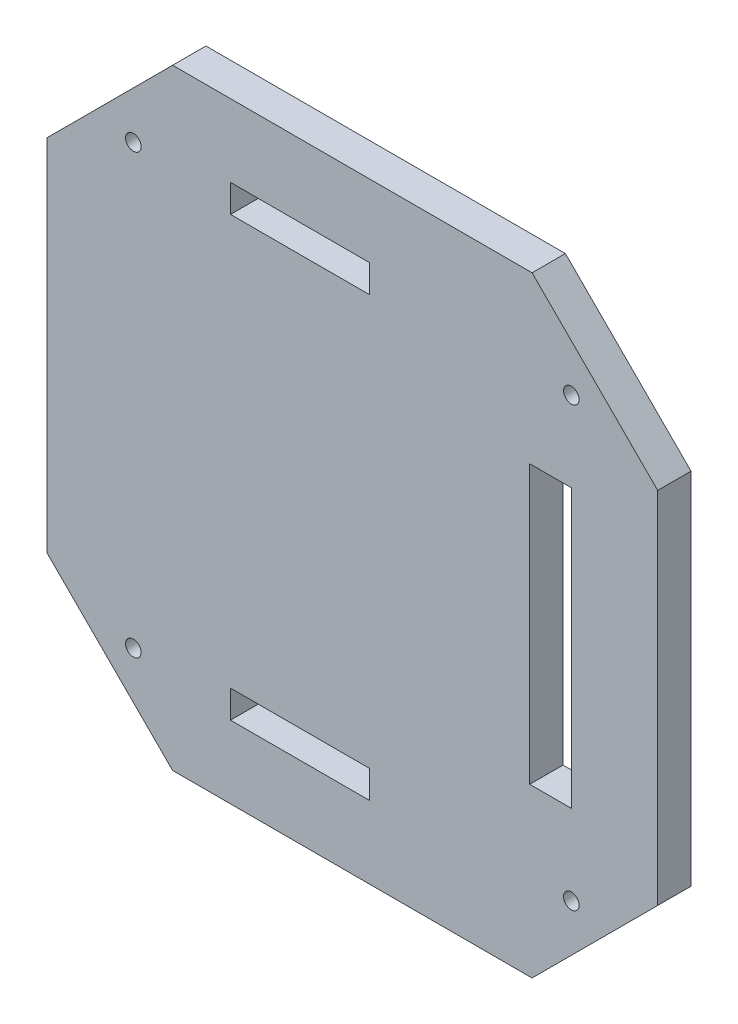
ISO-10303-21;
HEADER;
FILE_DESCRIPTION(('STEP AP214'),'2;1');
FILE_NAME('part.step','',(''),(''),'','','');
FILE_SCHEMA(('AUTOMOTIVE_DESIGN { 1 0 10303 214 1 1 1 1 }'));
ENDSEC;
DATA;
#1=APPLICATION_CONTEXT('core data for automotive mechanical design processes');
#2=APPLICATION_PROTOCOL_DEFINITION('international standard','automotive_design',2000,#1);
#3=PRODUCT_CONTEXT('',#1,'mechanical');
#4=PRODUCT('Part','Part','',(#3));
#5=PRODUCT_RELATED_PRODUCT_CATEGORY('part','',(#4));
#6=PRODUCT_DEFINITION_FORMATION('','',#4);
#7=PRODUCT_DEFINITION_CONTEXT('part definition',#1,'design');
#8=PRODUCT_DEFINITION('design','',#6,#7);
#9=PRODUCT_DEFINITION_SHAPE('','',#8);
#10=(LENGTH_UNIT() NAMED_UNIT(*) SI_UNIT(.MILLI.,.METRE.));
#11=(NAMED_UNIT(*) PLANE_ANGLE_UNIT() SI_UNIT($,.RADIAN.));
#12=(NAMED_UNIT(*) SI_UNIT($,.STERADIAN.) SOLID_ANGLE_UNIT());
#13=UNCERTAINTY_MEASURE_WITH_UNIT(LENGTH_MEASURE(1.E-05),#10,'distance_accuracy_value','');
#14=(GEOMETRIC_REPRESENTATION_CONTEXT(3) GLOBAL_UNCERTAINTY_ASSIGNED_CONTEXT((#13)) GLOBAL_UNIT_ASSIGNED_CONTEXT((#10,
#11,#12)) REPRESENTATION_CONTEXT('',''));
#15=CARTESIAN_POINT('',(0.,0.,0.));
#16=DIRECTION('',(0.,0.,1.));
#17=DIRECTION('',(1.,0.,0.));
#18=AXIS2_PLACEMENT_3D('',#15,#16,#17);
#19=CARTESIAN_POINT('',(9.63663148999142,-40.1714036228837,-33.5));
#20=DIRECTION('',(0.,0.,1.));
#21=DIRECTION('',(1.,0.,0.));
#22=AXIS2_PLACEMENT_3D('',#19,#20,#21);
#23=CYLINDRICAL_SURFACE('',#22,1.4);
#24=CARTESIAN_POINT('',(9.63663148999142,-40.1714036228837,-27.5));
#25=DIRECTION('',(0.,0.,-1.));
#26=DIRECTION('',(-1.,0.,0.));
#27=AXIS2_PLACEMENT_3D('',#24,#25,#26);
#28=CIRCLE('',#27,1.4);
#29=CARTESIAN_POINT('',(8.23663148999142,-40.1714036228837,-27.5));
#30=VERTEX_POINT('',#29);
#31=EDGE_CURVE('E299',#30,#30,#28,.T.);
#32=ORIENTED_EDGE('',*,*,#31,.F.);
#33=EDGE_LOOP('',(#32));
#34=FACE_BOUND('',#33,.T.);
#35=CARTESIAN_POINT('',(9.63663148999142,-40.1714036228837,-30.5));
#36=DIRECTION('',(0.,0.,-1.));
#37=DIRECTION('',(-1.,0.,0.));
#38=AXIS2_PLACEMENT_3D('',#35,#36,#37);
#39=CIRCLE('',#38,1.4);
#40=CARTESIAN_POINT('',(8.23663148999142,-40.1714036228837,-30.5));
#41=VERTEX_POINT('',#40);
#42=EDGE_CURVE('E36',#41,#41,#39,.T.);
#43=ORIENTED_EDGE('',*,*,#42,.T.);
#44=EDGE_LOOP('',(#43));
#45=FACE_BOUND('',#44,.T.);
#46=ADVANCED_FACE('F32',(#34,#45),#23,.F.);
#47=CARTESIAN_POINT('',(9.63663148999096,38.7158980049077,-33.5));
#48=DIRECTION('',(0.,0.,1.));
#49=DIRECTION('',(1.,0.,0.));
#50=AXIS2_PLACEMENT_3D('',#47,#48,#49);
#51=CYLINDRICAL_SURFACE('',#50,1.4);
#52=CARTESIAN_POINT('',(9.63663148999096,38.7158980049077,-27.5));
#53=DIRECTION('',(0.,0.,-1.));
#54=DIRECTION('',(-1.,0.,0.));
#55=AXIS2_PLACEMENT_3D('',#52,#53,#54);
#56=CIRCLE('',#55,1.4);
#57=CARTESIAN_POINT('',(8.23663148999096,38.7158980049077,-27.5));
#58=VERTEX_POINT('',#57);
#59=EDGE_CURVE('E308',#58,#58,#56,.T.);
#60=ORIENTED_EDGE('',*,*,#59,.F.);
#61=EDGE_LOOP('',(#60));
#62=FACE_BOUND('',#61,.T.);
#63=CARTESIAN_POINT('',(9.63663148999096,38.7158980049077,-30.5));
#64=DIRECTION('',(0.,0.,-1.));
#65=DIRECTION('',(-1.,0.,0.));
#66=AXIS2_PLACEMENT_3D('',#63,#64,#65);
#67=CIRCLE('',#66,1.4);
#68=CARTESIAN_POINT('',(8.23663148999096,38.7158980049077,-30.5));
#69=VERTEX_POINT('',#68);
#70=EDGE_CURVE('E281',#69,#69,#67,.T.);
#71=ORIENTED_EDGE('',*,*,#70,.T.);
#72=EDGE_LOOP('',(#71));
#73=FACE_BOUND('',#72,.T.);
#74=ADVANCED_FACE('F371',(#62,#73),#51,.F.);
#75=CARTESIAN_POINT('',(-69.2506701378009,-40.1714036228842,-33.5));
#76=DIRECTION('',(0.,0.,1.));
#77=DIRECTION('',(1.,0.,0.));
#78=AXIS2_PLACEMENT_3D('',#75,#76,#77);
#79=CYLINDRICAL_SURFACE('',#78,1.4);
#80=CARTESIAN_POINT('',(-69.2506701378009,-40.1714036228842,-27.5));
#81=DIRECTION('',(0.,0.,-1.));
#82=DIRECTION('',(-1.,0.,0.));
#83=AXIS2_PLACEMENT_3D('',#80,#81,#82);
#84=CIRCLE('',#83,1.4);
#85=CARTESIAN_POINT('',(-70.6506701378009,-40.1714036228842,-27.5));
#86=VERTEX_POINT('',#85);
#87=EDGE_CURVE('E302',#86,#86,#84,.T.);
#88=ORIENTED_EDGE('',*,*,#87,.F.);
#89=EDGE_LOOP('',(#88));
#90=FACE_BOUND('',#89,.T.);
#91=CARTESIAN_POINT('',(-69.2506701378009,-40.1714036228842,-30.5));
#92=DIRECTION('',(0.,0.,-1.));
#93=DIRECTION('',(-1.,0.,0.));
#94=AXIS2_PLACEMENT_3D('',#91,#92,#93);
#95=CIRCLE('',#94,1.4);
#96=CARTESIAN_POINT('',(-70.6506701378009,-40.1714036228842,-30.5));
#97=VERTEX_POINT('',#96);
#98=EDGE_CURVE('E288',#97,#97,#95,.T.);
#99=ORIENTED_EDGE('',*,*,#98,.T.);
#100=EDGE_LOOP('',(#99));
#101=FACE_BOUND('',#100,.T.);
#102=ADVANCED_FACE('F479',(#90,#101),#79,.F.);
#103=CARTESIAN_POINT('',(-69.2506701378011,38.7158980049076,-33.5));
#104=DIRECTION('',(0.,0.,1.));
#105=DIRECTION('',(1.,0.,0.));
#106=AXIS2_PLACEMENT_3D('',#103,#104,#105);
#107=CYLINDRICAL_SURFACE('',#106,1.4);
#108=CARTESIAN_POINT('',(-69.2506701378011,38.7158980049076,-27.5));
#109=DIRECTION('',(0.,0.,-1.));
#110=DIRECTION('',(-1.,0.,0.));
#111=AXIS2_PLACEMENT_3D('',#108,#109,#110);
#112=CIRCLE('',#111,1.4);
#113=CARTESIAN_POINT('',(-70.6506701378011,38.7158980049076,-27.5));
#114=VERTEX_POINT('',#113);
#115=EDGE_CURVE('E305',#114,#114,#112,.T.);
#116=ORIENTED_EDGE('',*,*,#115,.F.);
#117=EDGE_LOOP('',(#116));
#118=FACE_BOUND('',#117,.T.);
#119=CARTESIAN_POINT('',(-69.2506701378011,38.7158980049076,-30.5));
#120=DIRECTION('',(0.,0.,-1.));
#121=DIRECTION('',(-1.,0.,0.));
#122=AXIS2_PLACEMENT_3D('',#119,#120,#121);
#123=CIRCLE('',#122,1.4);
#124=CARTESIAN_POINT('',(-70.6506701378011,38.7158980049076,-30.5));
#125=VERTEX_POINT('',#124);
#126=EDGE_CURVE('E295',#125,#125,#123,.T.);
#127=ORIENTED_EDGE('',*,*,#126,.T.);
#128=EDGE_LOOP('',(#127));
#129=FACE_BOUND('',#128,.T.);
#130=ADVANCED_FACE('F390',(#118,#129),#107,.F.);
#131=CARTESIAN_POINT('',(0.,0.,-33.5));
#132=DIRECTION('',(0.,0.,1.));
#133=DIRECTION('',(1.,0.,0.));
#134=AXIS2_PLACEMENT_3D('',#131,#132,#133);
#135=PLANE('',#134);
#136=DIRECTION('',(-1.,0.,0.));
#137=VECTOR('',#136,1.);
#138=CARTESIAN_POINT('',(-51.7506701378009,-42.6714036228842,-33.5));
#139=LINE('',#138,#137);
#140=CARTESIAN_POINT('',(-26.7506701378009,-42.6714036228842,-33.5));
#141=VERTEX_POINT('',#140);
#142=CARTESIAN_POINT('',(-51.7506701378009,-42.6714036228842,-33.5));
#143=VERTEX_POINT('',#142);
#144=EDGE_CURVE('E201',#141,#143,#139,.T.);
#145=ORIENTED_EDGE('',*,*,#144,.F.);
#146=DIRECTION('',(0.,-1.,0.));
#147=VECTOR('',#146,1.);
#148=CARTESIAN_POINT('',(-26.7506701378009,-42.6714036228842,-33.5));
#149=LINE('',#148,#147);
#150=CARTESIAN_POINT('',(-26.7506701378009,-37.6714036228842,-33.5));
#151=VERTEX_POINT('',#150);
#152=EDGE_CURVE('E49',#151,#141,#149,.T.);
#153=ORIENTED_EDGE('',*,*,#152,.F.);
#154=DIRECTION('',(1.,0.,0.));
#155=VECTOR('',#154,1.);
#156=CARTESIAN_POINT('',(-51.7506701378009,-37.6714036228842,-33.5));
#157=LINE('',#156,#155);
#158=CARTESIAN_POINT('',(-51.7506701378009,-37.6714036228842,-33.5));
#159=VERTEX_POINT('',#158);
#160=EDGE_CURVE('E192',#159,#151,#157,.T.);
#161=ORIENTED_EDGE('',*,*,#160,.F.);
#162=DIRECTION('',(0.,1.,0.));
#163=VECTOR('',#162,1.);
#164=CARTESIAN_POINT('',(-51.7506701378009,-42.6714036228842,-33.5));
#165=LINE('',#164,#163);
#166=EDGE_CURVE('E195',#143,#159,#165,.T.);
#167=ORIENTED_EDGE('',*,*,#166,.F.);
#168=EDGE_LOOP('',(#145,#153,#161,#167));
#169=FACE_BOUND('',#168,.T.);
#170=DIRECTION('',(0.,-1.,0.));
#171=VECTOR('',#170,1.);
#172=CARTESIAN_POINT('',(-26.7506701378009,41.2158980049077,-33.5));
#173=LINE('',#172,#171);
#174=CARTESIAN_POINT('',(-26.7506701378009,41.2158980049077,-33.5));
#175=VERTEX_POINT('',#174);
#176=CARTESIAN_POINT('',(-26.7506701378009,36.2158980049077,-33.5));
#177=VERTEX_POINT('',#176);
#178=EDGE_CURVE('E227',#175,#177,#173,.T.);
#179=ORIENTED_EDGE('',*,*,#178,.F.);
#180=DIRECTION('',(1.,0.,0.));
#181=VECTOR('',#180,1.);
#182=CARTESIAN_POINT('',(-51.7506701378009,41.2158980049077,-33.5));
#183=LINE('',#182,#181);
#184=CARTESIAN_POINT('',(-51.7506701378009,41.2158980049077,-33.5));
#185=VERTEX_POINT('',#184);
#186=EDGE_CURVE('E57',#185,#175,#183,.T.);
#187=ORIENTED_EDGE('',*,*,#186,.F.);
#188=DIRECTION('',(0.,1.,0.));
#189=VECTOR('',#188,1.);
#190=CARTESIAN_POINT('',(-51.7506701378009,41.2158980049077,-33.5));
#191=LINE('',#190,#189);
#192=CARTESIAN_POINT('',(-51.7506701378009,36.2158980049077,-33.5));
#193=VERTEX_POINT('',#192);
#194=EDGE_CURVE('E216',#193,#185,#191,.T.);
#195=ORIENTED_EDGE('',*,*,#194,.F.);
#196=DIRECTION('',(-1.,0.,0.));
#197=VECTOR('',#196,1.);
#198=CARTESIAN_POINT('',(-51.7506701378009,36.2158980049077,-33.5));
#199=LINE('',#198,#197);
#200=EDGE_CURVE('E231',#177,#193,#199,.T.);
#201=ORIENTED_EDGE('',*,*,#200,.F.);
#202=EDGE_LOOP('',(#179,#187,#195,#201));
#203=FACE_BOUND('',#202,.T.);
#204=DIRECTION('',(-1.,0.,0.));
#205=VECTOR('',#204,1.);
#206=CARTESIAN_POINT('',(9.6366314899914,-25.727752808988,-33.5));
#207=LINE('',#206,#205);
#208=CARTESIAN_POINT('',(9.6366314899914,-25.727752808988,-33.5));
#209=VERTEX_POINT('',#208);
#210=CARTESIAN_POINT('',(2.1366314899914,-25.727752808988,-33.5));
#211=VERTEX_POINT('',#210);
#212=EDGE_CURVE('E258',#209,#211,#207,.T.);
#213=ORIENTED_EDGE('',*,*,#212,.F.);
#214=DIRECTION('',(0.,-1.,0.));
#215=VECTOR('',#214,1.);
#216=CARTESIAN_POINT('',(9.63663148999141,24.272247191012,-33.5));
#217=LINE('',#216,#215);
#218=CARTESIAN_POINT('',(9.63663148999141,24.272247191012,-33.5));
#219=VERTEX_POINT('',#218);
#220=EDGE_CURVE('E256',#219,#209,#217,.T.);
#221=ORIENTED_EDGE('',*,*,#220,.F.);
#222=DIRECTION('',(1.,0.,0.));
#223=VECTOR('',#222,1.);
#224=CARTESIAN_POINT('',(9.63663148999141,24.272247191012,-33.5));
#225=LINE('',#224,#223);
#226=CARTESIAN_POINT('',(2.13663148999141,24.272247191012,-33.5));
#227=VERTEX_POINT('',#226);
#228=EDGE_CURVE('E246',#227,#219,#225,.T.);
#229=ORIENTED_EDGE('',*,*,#228,.F.);
#230=DIRECTION('',(0.,1.,0.));
#231=VECTOR('',#230,1.);
#232=CARTESIAN_POINT('',(2.13663148999141,24.272247191012,-33.5));
#233=LINE('',#232,#231);
#234=EDGE_CURVE('E261',#211,#227,#233,.T.);
#235=ORIENTED_EDGE('',*,*,#234,.F.);
#236=EDGE_LOOP('',(#213,#221,#229,#235));
#237=FACE_BOUND('',#236,.T.);
#238=CARTESIAN_POINT('',(9.63663148999114,-40.171403622884,-33.5));
#239=DIRECTION('',(0.,0.,-1.));
#240=DIRECTION('',(1.,0.,0.));
#241=AXIS2_PLACEMENT_3D('',#238,#239,#240);
#242=CIRCLE('',#241,3.25000000000001);
#243=CARTESIAN_POINT('',(12.8866314899912,-40.171403622884,-33.5));
#244=VERTEX_POINT('',#243);
#245=EDGE_CURVE('E208',#244,#244,#242,.T.);
#246=ORIENTED_EDGE('',*,*,#245,.F.);
#247=EDGE_LOOP('',(#246));
#248=FACE_BOUND('',#247,.T.);
#249=CARTESIAN_POINT('',(9.63663148999113,38.7158980049076,-33.5));
#250=DIRECTION('',(0.,0.,1.));
#251=DIRECTION('',(1.,0.,0.));
#252=AXIS2_PLACEMENT_3D('',#249,#250,#251);
#253=CIRCLE('',#252,3.25000000000001);
#254=CARTESIAN_POINT('',(12.8866314899911,38.7158980049076,-33.5));
#255=VERTEX_POINT('',#254);
#256=EDGE_CURVE('E282',#255,#255,#253,.T.);
#257=ORIENTED_EDGE('',*,*,#256,.T.);
#258=EDGE_LOOP('',(#257));
#259=FACE_BOUND('',#258,.T.);
#260=CARTESIAN_POINT('',(-69.2506701378011,-40.171403622884,-33.5));
#261=DIRECTION('',(0.,0.,1.));
#262=DIRECTION('',(-1.,0.,0.));
#263=AXIS2_PLACEMENT_3D('',#260,#261,#262);
#264=CIRCLE('',#263,3.25000000000001);
#265=CARTESIAN_POINT('',(-72.5006701378011,-40.171403622884,-33.5));
#266=VERTEX_POINT('',#265);
#267=EDGE_CURVE('E289',#266,#266,#264,.T.);
#268=ORIENTED_EDGE('',*,*,#267,.T.);
#269=EDGE_LOOP('',(#268));
#270=FACE_BOUND('',#269,.T.);
#271=CARTESIAN_POINT('',(-69.2506701378011,38.7158980049076,-33.5));
#272=DIRECTION('',(0.,0.,-1.));
#273=DIRECTION('',(-1.,0.,0.));
#274=AXIS2_PLACEMENT_3D('',#271,#272,#273);
#275=CIRCLE('',#274,3.25000000000001);
#276=CARTESIAN_POINT('',(-72.5006701378011,38.7158980049076,-33.5));
#277=VERTEX_POINT('',#276);
#278=EDGE_CURVE('E296',#277,#277,#275,.T.);
#279=ORIENTED_EDGE('',*,*,#278,.F.);
#280=EDGE_LOOP('',(#279));
#281=FACE_BOUND('',#280,.T.);
#282=DIRECTION('',(-0.707106781186549,-0.707106781186546,0.));
#283=VECTOR('',#282,1.);
#284=CARTESIAN_POINT('',(25.192980676095,-33.1003358110187,-33.5));
#285=LINE('',#284,#283);
#286=CARTESIAN_POINT('',(25.192980676095,-33.1003358110187,-33.5));
#287=VERTEX_POINT('',#286);
#288=CARTESIAN_POINT('',(2.56556367812544,-55.7277528089882,-33.5));
#289=VERTEX_POINT('',#288);
#290=EDGE_CURVE('E312',#287,#289,#285,.T.);
#291=ORIENTED_EDGE('',*,*,#290,.T.);
#292=DIRECTION('',(-1.,0.,0.));
#293=VECTOR('',#292,1.);
#294=CARTESIAN_POINT('',(2.56556367812544,-55.7277528089882,-33.5));
#295=LINE('',#294,#293);
#296=CARTESIAN_POINT('',(-62.1796023259354,-55.7277528089882,-33.5));
#297=VERTEX_POINT('',#296);
#298=EDGE_CURVE('E315',#289,#297,#295,.T.);
#299=ORIENTED_EDGE('',*,*,#298,.T.);
#300=DIRECTION('',(-0.707106781186549,0.707106781186546,0.));
#301=VECTOR('',#300,1.);
#302=CARTESIAN_POINT('',(-84.807019323905,-33.1003358110187,-33.5));
#303=LINE('',#302,#301);
#304=CARTESIAN_POINT('',(-84.807019323905,-33.1003358110187,-33.5));
#305=VERTEX_POINT('',#304);
#306=EDGE_CURVE('E318',#297,#305,#303,.T.);
#307=ORIENTED_EDGE('',*,*,#306,.T.);
#308=DIRECTION('',(0.,1.,0.));
#309=VECTOR('',#308,1.);
#310=CARTESIAN_POINT('',(-84.807019323905,-33.1003358110187,-33.5));
#311=LINE('',#310,#309);
#312=CARTESIAN_POINT('',(-84.807019323905,31.6448301930423,-33.5));
#313=VERTEX_POINT('',#312);
#314=EDGE_CURVE('E320',#305,#313,#311,.T.);
#315=ORIENTED_EDGE('',*,*,#314,.T.);
#316=DIRECTION('',(0.707106781186549,0.707106781186546,0.));
#317=VECTOR('',#316,1.);
#318=CARTESIAN_POINT('',(-84.807019323905,31.6448301930423,-33.5));
#319=LINE('',#318,#317);
#320=CARTESIAN_POINT('',(-62.1796023259354,54.2722471910117,-33.5));
#321=VERTEX_POINT('',#320);
#322=EDGE_CURVE('E322',#313,#321,#319,.T.);
#323=ORIENTED_EDGE('',*,*,#322,.T.);
#324=DIRECTION('',(1.,0.,0.));
#325=VECTOR('',#324,1.);
#326=CARTESIAN_POINT('',(2.56556367812544,54.2722471910118,-33.5));
#327=LINE('',#326,#325);
#328=CARTESIAN_POINT('',(2.56556367812544,54.2722471910118,-33.5));
#329=VERTEX_POINT('',#328);
#330=EDGE_CURVE('E324',#321,#329,#327,.T.);
#331=ORIENTED_EDGE('',*,*,#330,.T.);
#332=DIRECTION('',(0.707106781186549,-0.707106781186546,0.));
#333=VECTOR('',#332,1.);
#334=CARTESIAN_POINT('',(25.192980676095,31.6448301930423,-33.5));
#335=LINE('',#334,#333);
#336=CARTESIAN_POINT('',(25.192980676095,31.6448301930423,-33.5));
#337=VERTEX_POINT('',#336);
#338=EDGE_CURVE('E326',#329,#337,#335,.T.);
#339=ORIENTED_EDGE('',*,*,#338,.T.);
#340=DIRECTION('',(0.,-1.,0.));
#341=VECTOR('',#340,1.);
#342=CARTESIAN_POINT('',(25.192980676095,-33.1003358110187,-33.5));
#343=LINE('',#342,#341);
#344=EDGE_CURVE('E328',#337,#287,#343,.T.);
#345=ORIENTED_EDGE('',*,*,#344,.T.);
#346=EDGE_LOOP('',(#291,#299,#307,#315,#323,#331,#339,#345));
#347=FACE_BOUND('',#346,.T.);
#348=ADVANCED_FACE('F387',(#169,#203,#237,#248,#259,#270,#281,#347),#135,.F.);
#349=CARTESIAN_POINT('',(0.,0.,-27.5));
#350=DIRECTION('',(0.,0.,1.));
#351=DIRECTION('',(1.,0.,0.));
#352=AXIS2_PLACEMENT_3D('',#349,#350,#351);
#353=PLANE('',#352);
#354=DIRECTION('',(0.,-1.,0.));
#355=VECTOR('',#354,1.);
#356=CARTESIAN_POINT('',(-26.7506701378009,-42.6714036228842,-27.5));
#357=LINE('',#356,#355);
#358=CARTESIAN_POINT('',(-26.7506701378009,-37.6714036228842,-27.5));
#359=VERTEX_POINT('',#358);
#360=CARTESIAN_POINT('',(-26.7506701378009,-42.6714036228842,-27.5));
#361=VERTEX_POINT('',#360);
#362=EDGE_CURVE('E173',#359,#361,#357,.T.);
#363=ORIENTED_EDGE('',*,*,#362,.T.);
#364=DIRECTION('',(-1.,0.,0.));
#365=VECTOR('',#364,1.);
#366=CARTESIAN_POINT('',(-51.7506701378009,-42.6714036228842,-27.5));
#367=LINE('',#366,#365);
#368=CARTESIAN_POINT('',(-51.7506701378009,-42.6714036228842,-27.5));
#369=VERTEX_POINT('',#368);
#370=EDGE_CURVE('E183',#361,#369,#367,.T.);
#371=ORIENTED_EDGE('',*,*,#370,.T.);
#372=DIRECTION('',(0.,1.,0.));
#373=VECTOR('',#372,1.);
#374=CARTESIAN_POINT('',(-51.7506701378009,-42.6714036228842,-27.5));
#375=LINE('',#374,#373);
#376=CARTESIAN_POINT('',(-51.7506701378009,-37.6714036228842,-27.5));
#377=VERTEX_POINT('',#376);
#378=EDGE_CURVE('E187',#369,#377,#375,.T.);
#379=ORIENTED_EDGE('',*,*,#378,.T.);
#380=DIRECTION('',(1.,0.,0.));
#381=VECTOR('',#380,1.);
#382=CARTESIAN_POINT('',(-51.7506701378009,-37.6714036228842,-27.5));
#383=LINE('',#382,#381);
#384=EDGE_CURVE('E179',#377,#359,#383,.T.);
#385=ORIENTED_EDGE('',*,*,#384,.T.);
#386=EDGE_LOOP('',(#363,#371,#379,#385));
#387=FACE_BOUND('',#386,.T.);
#388=DIRECTION('',(1.,0.,0.));
#389=VECTOR('',#388,1.);
#390=CARTESIAN_POINT('',(-51.7506701378009,41.2158980049077,-27.5));
#391=LINE('',#390,#389);
#392=CARTESIAN_POINT('',(-51.7506701378009,41.2158980049077,-27.5));
#393=VERTEX_POINT('',#392);
#394=CARTESIAN_POINT('',(-26.7506701378009,41.2158980049077,-27.5));
#395=VERTEX_POINT('',#394);
#396=EDGE_CURVE('E212',#393,#395,#391,.T.);
#397=ORIENTED_EDGE('',*,*,#396,.T.);
#398=DIRECTION('',(0.,-1.,0.));
#399=VECTOR('',#398,1.);
#400=CARTESIAN_POINT('',(-26.7506701378009,41.2158980049077,-27.5));
#401=LINE('',#400,#399);
#402=CARTESIAN_POINT('',(-26.7506701378009,36.2158980049077,-27.5));
#403=VERTEX_POINT('',#402);
#404=EDGE_CURVE('E215',#395,#403,#401,.T.);
#405=ORIENTED_EDGE('',*,*,#404,.T.);
#406=DIRECTION('',(-1.,0.,0.));
#407=VECTOR('',#406,1.);
#408=CARTESIAN_POINT('',(-51.7506701378009,36.2158980049077,-27.5));
#409=LINE('',#408,#407);
#410=CARTESIAN_POINT('',(-51.7506701378009,36.2158980049077,-27.5));
#411=VERTEX_POINT('',#410);
#412=EDGE_CURVE('E219',#403,#411,#409,.T.);
#413=ORIENTED_EDGE('',*,*,#412,.T.);
#414=DIRECTION('',(0.,1.,0.));
#415=VECTOR('',#414,1.);
#416=CARTESIAN_POINT('',(-51.7506701378009,41.2158980049077,-27.5));
#417=LINE('',#416,#415);
#418=EDGE_CURVE('E222',#411,#393,#417,.T.);
#419=ORIENTED_EDGE('',*,*,#418,.T.);
#420=EDGE_LOOP('',(#397,#405,#413,#419));
#421=FACE_BOUND('',#420,.T.);
#422=DIRECTION('',(0.,-1.,0.));
#423=VECTOR('',#422,1.);
#424=CARTESIAN_POINT('',(9.63663148999141,24.272247191012,-27.5));
#425=LINE('',#424,#423);
#426=CARTESIAN_POINT('',(9.63663148999141,24.272247191012,-27.5));
#427=VERTEX_POINT('',#426);
#428=CARTESIAN_POINT('',(9.6366314899914,-25.727752808988,-27.5));
#429=VERTEX_POINT('',#428);
#430=EDGE_CURVE('E242',#427,#429,#425,.T.);
#431=ORIENTED_EDGE('',*,*,#430,.T.);
#432=DIRECTION('',(-1.,0.,0.));
#433=VECTOR('',#432,1.);
#434=CARTESIAN_POINT('',(9.6366314899914,-25.727752808988,-27.5));
#435=LINE('',#434,#433);
#436=CARTESIAN_POINT('',(2.1366314899914,-25.727752808988,-27.5));
#437=VERTEX_POINT('',#436);
#438=EDGE_CURVE('E245',#429,#437,#435,.T.);
#439=ORIENTED_EDGE('',*,*,#438,.T.);
#440=DIRECTION('',(0.,1.,0.));
#441=VECTOR('',#440,1.);
#442=CARTESIAN_POINT('',(2.13663148999141,24.272247191012,-27.5));
#443=LINE('',#442,#441);
#444=CARTESIAN_POINT('',(2.13663148999141,24.272247191012,-27.5));
#445=VERTEX_POINT('',#444);
#446=EDGE_CURVE('E249',#437,#445,#443,.T.);
#447=ORIENTED_EDGE('',*,*,#446,.T.);
#448=DIRECTION('',(1.,0.,0.));
#449=VECTOR('',#448,1.);
#450=CARTESIAN_POINT('',(9.63663148999141,24.272247191012,-27.5));
#451=LINE('',#450,#449);
#452=EDGE_CURVE('E252',#445,#427,#451,.T.);
#453=ORIENTED_EDGE('',*,*,#452,.T.);
#454=EDGE_LOOP('',(#431,#439,#447,#453));
#455=FACE_BOUND('',#454,.T.);
#456=ORIENTED_EDGE('',*,*,#87,.T.);
#457=EDGE_LOOP('',(#456));
#458=FACE_BOUND('',#457,.T.);
#459=ORIENTED_EDGE('',*,*,#59,.T.);
#460=EDGE_LOOP('',(#459));
#461=FACE_BOUND('',#460,.T.);
#462=DIRECTION('',(-0.707106781186549,-0.707106781186546,0.));
#463=VECTOR('',#462,1.);
#464=CARTESIAN_POINT('',(25.192980676095,-33.1003358110187,-27.5));
#465=LINE('',#464,#463);
#466=CARTESIAN_POINT('',(25.192980676095,-33.1003358110187,-27.5));
#467=VERTEX_POINT('',#466);
#468=CARTESIAN_POINT('',(2.56556367812544,-55.7277528089882,-27.5));
#469=VERTEX_POINT('',#468);
#470=EDGE_CURVE('E311',#467,#469,#465,.T.);
#471=ORIENTED_EDGE('',*,*,#470,.F.);
#472=DIRECTION('',(0.,-1.,0.));
#473=VECTOR('',#472,1.);
#474=CARTESIAN_POINT('',(25.192980676095,-33.1003358110187,-27.5));
#475=LINE('',#474,#473);
#476=CARTESIAN_POINT('',(25.192980676095,31.6448301930423,-27.5));
#477=VERTEX_POINT('',#476);
#478=EDGE_CURVE('E316',#477,#467,#475,.T.);
#479=ORIENTED_EDGE('',*,*,#478,.F.);
#480=DIRECTION('',(0.707106781186549,-0.707106781186546,0.));
#481=VECTOR('',#480,1.);
#482=CARTESIAN_POINT('',(25.192980676095,31.6448301930423,-27.5));
#483=LINE('',#482,#481);
#484=CARTESIAN_POINT('',(2.56556367812544,54.2722471910118,-27.5));
#485=VERTEX_POINT('',#484);
#486=EDGE_CURVE('E343',#485,#477,#483,.T.);
#487=ORIENTED_EDGE('',*,*,#486,.F.);
#488=DIRECTION('',(1.,0.,0.));
#489=VECTOR('',#488,1.);
#490=CARTESIAN_POINT('',(2.56556367812544,54.2722471910118,-27.5));
#491=LINE('',#490,#489);
#492=CARTESIAN_POINT('',(-62.1796023259354,54.2722471910117,-27.5));
#493=VERTEX_POINT('',#492);
#494=EDGE_CURVE('E341',#493,#485,#491,.T.);
#495=ORIENTED_EDGE('',*,*,#494,.F.);
#496=DIRECTION('',(0.707106781186549,0.707106781186546,0.));
#497=VECTOR('',#496,1.);
#498=CARTESIAN_POINT('',(-84.807019323905,31.6448301930423,-27.5));
#499=LINE('',#498,#497);
#500=CARTESIAN_POINT('',(-84.807019323905,31.6448301930423,-27.5));
#501=VERTEX_POINT('',#500);
#502=EDGE_CURVE('E339',#501,#493,#499,.T.);
#503=ORIENTED_EDGE('',*,*,#502,.F.);
#504=DIRECTION('',(0.,1.,0.));
#505=VECTOR('',#504,1.);
#506=CARTESIAN_POINT('',(-84.807019323905,-33.1003358110187,-27.5));
#507=LINE('',#506,#505);
#508=CARTESIAN_POINT('',(-84.807019323905,-33.1003358110187,-27.5));
#509=VERTEX_POINT('',#508);
#510=EDGE_CURVE('E337',#509,#501,#507,.T.);
#511=ORIENTED_EDGE('',*,*,#510,.F.);
#512=DIRECTION('',(-0.707106781186549,0.707106781186546,0.));
#513=VECTOR('',#512,1.);
#514=CARTESIAN_POINT('',(-84.807019323905,-33.1003358110187,-27.5));
#515=LINE('',#514,#513);
#516=CARTESIAN_POINT('',(-62.1796023259354,-55.7277528089882,-27.5));
#517=VERTEX_POINT('',#516);
#518=EDGE_CURVE('E335',#517,#509,#515,.T.);
#519=ORIENTED_EDGE('',*,*,#518,.F.);
#520=DIRECTION('',(-1.,0.,0.));
#521=VECTOR('',#520,1.);
#522=CARTESIAN_POINT('',(2.56556367812544,-55.7277528089882,-27.5));
#523=LINE('',#522,#521);
#524=EDGE_CURVE('E333',#469,#517,#523,.T.);
#525=ORIENTED_EDGE('',*,*,#524,.F.);
#526=EDGE_LOOP('',(#471,#479,#487,#495,#503,#511,#519,#525));
#527=FACE_BOUND('',#526,.T.);
#528=ORIENTED_EDGE('',*,*,#115,.T.);
#529=EDGE_LOOP('',(#528));
#530=FACE_BOUND('',#529,.T.);
#531=ORIENTED_EDGE('',*,*,#31,.T.);
#532=EDGE_LOOP('',(#531));
#533=FACE_BOUND('',#532,.T.);
#534=ADVANCED_FACE('F189',(#387,#421,#455,#458,#461,#527,#530,#533),#353,.T.);
#535=CARTESIAN_POINT('',(25.192980676095,-33.1003358110187,-33.5));
#536=DIRECTION('',(-0.707106781186546,0.707106781186549,0.));
#537=DIRECTION('',(-0.707106781186549,-0.707106781186546,0.));
#538=AXIS2_PLACEMENT_3D('',#535,#536,#537);
#539=PLANE('',#538);
#540=ORIENTED_EDGE('',*,*,#470,.T.);
#541=DIRECTION('',(0.,0.,1.));
#542=VECTOR('',#541,1.);
#543=CARTESIAN_POINT('',(2.56556367812544,-55.7277528089882,-33.5));
#544=LINE('',#543,#542);
#545=EDGE_CURVE('E11',#289,#469,#544,.T.);
#546=ORIENTED_EDGE('',*,*,#545,.F.);
#547=ORIENTED_EDGE('',*,*,#290,.F.);
#548=DIRECTION('',(0.,0.,1.));
#549=VECTOR('',#548,1.);
#550=CARTESIAN_POINT('',(25.192980676095,-33.1003358110187,-33.5));
#551=LINE('',#550,#549);
#552=EDGE_CURVE('E330',#287,#467,#551,.T.);
#553=ORIENTED_EDGE('',*,*,#552,.T.);
#554=EDGE_LOOP('',(#540,#546,#547,#553));
#555=FACE_BOUND('',#554,.T.);
#556=ADVANCED_FACE('F34',(#555),#539,.F.);
#557=CARTESIAN_POINT('',(2.56556367812544,-55.7277528089882,-33.5));
#558=DIRECTION('',(0.,1.,0.));
#559=DIRECTION('',(0.,0.,1.));
#560=AXIS2_PLACEMENT_3D('',#557,#558,#559);
#561=PLANE('',#560);
#562=ORIENTED_EDGE('',*,*,#524,.T.);
#563=DIRECTION('',(0.,0.,1.));
#564=VECTOR('',#563,1.);
#565=CARTESIAN_POINT('',(-62.1796023259354,-55.7277528089882,-33.5));
#566=LINE('',#565,#564);
#567=EDGE_CURVE('E41',#297,#517,#566,.T.);
#568=ORIENTED_EDGE('',*,*,#567,.F.);
#569=ORIENTED_EDGE('',*,*,#298,.F.);
#570=ORIENTED_EDGE('',*,*,#545,.T.);
#571=EDGE_LOOP('',(#562,#568,#569,#570));
#572=FACE_BOUND('',#571,.T.);
#573=ADVANCED_FACE('F405',(#572),#561,.F.);
#574=CARTESIAN_POINT('',(-84.807019323905,-33.1003358110187,-33.5));
#575=DIRECTION('',(0.707106781186546,0.707106781186549,0.));
#576=DIRECTION('',(-0.707106781186549,0.707106781186546,0.));
#577=AXIS2_PLACEMENT_3D('',#574,#575,#576);
#578=PLANE('',#577);
#579=ORIENTED_EDGE('',*,*,#518,.T.);
#580=DIRECTION('',(0.,0.,1.));
#581=VECTOR('',#580,1.);
#582=CARTESIAN_POINT('',(-84.807019323905,-33.1003358110187,-33.5));
#583=LINE('',#582,#581);
#584=EDGE_CURVE('E360',#305,#509,#583,.T.);
#585=ORIENTED_EDGE('',*,*,#584,.F.);
#586=ORIENTED_EDGE('',*,*,#306,.F.);
#587=ORIENTED_EDGE('',*,*,#567,.T.);
#588=EDGE_LOOP('',(#579,#585,#586,#587));
#589=FACE_BOUND('',#588,.T.);
#590=ADVANCED_FACE('F410',(#589),#578,.F.);
#591=CARTESIAN_POINT('',(-84.807019323905,-33.1003358110187,-33.5));
#592=DIRECTION('',(1.,0.,0.));
#593=DIRECTION('',(0.,0.,-1.));
#594=AXIS2_PLACEMENT_3D('',#591,#592,#593);
#595=PLANE('',#594);
#596=ORIENTED_EDGE('',*,*,#510,.T.);
#597=DIRECTION('',(0.,0.,1.));
#598=VECTOR('',#597,1.);
#599=CARTESIAN_POINT('',(-84.807019323905,31.6448301930423,-33.5));
#600=LINE('',#599,#598);
#601=EDGE_CURVE('E357',#313,#501,#600,.T.);
#602=ORIENTED_EDGE('',*,*,#601,.F.);
#603=ORIENTED_EDGE('',*,*,#314,.F.);
#604=ORIENTED_EDGE('',*,*,#584,.T.);
#605=EDGE_LOOP('',(#596,#602,#603,#604));
#606=FACE_BOUND('',#605,.T.);
#607=ADVANCED_FACE('F416',(#606),#595,.F.);
#608=CARTESIAN_POINT('',(-84.807019323905,31.6448301930423,-33.5));
#609=DIRECTION('',(0.707106781186546,-0.707106781186549,0.));
#610=DIRECTION('',(0.707106781186549,0.707106781186546,0.));
#611=AXIS2_PLACEMENT_3D('',#608,#609,#610);
#612=PLANE('',#611);
#613=ORIENTED_EDGE('',*,*,#502,.T.);
#614=DIRECTION('',(0.,0.,1.));
#615=VECTOR('',#614,1.);
#616=CARTESIAN_POINT('',(-62.1796023259354,54.2722471910117,-33.5));
#617=LINE('',#616,#615);
#618=EDGE_CURVE('E354',#321,#493,#617,.T.);
#619=ORIENTED_EDGE('',*,*,#618,.F.);
#620=ORIENTED_EDGE('',*,*,#322,.F.);
#621=ORIENTED_EDGE('',*,*,#601,.T.);
#622=EDGE_LOOP('',(#613,#619,#620,#621));
#623=FACE_BOUND('',#622,.T.);
#624=ADVANCED_FACE('F420',(#623),#612,.F.);
#625=CARTESIAN_POINT('',(2.56556367812544,54.2722471910118,-33.5));
#626=DIRECTION('',(0.,-1.,0.));
#627=DIRECTION('',(1.,0.,0.));
#628=AXIS2_PLACEMENT_3D('',#625,#626,#627);
#629=PLANE('',#628);
#630=ORIENTED_EDGE('',*,*,#494,.T.);
#631=DIRECTION('',(0.,0.,1.));
#632=VECTOR('',#631,1.);
#633=CARTESIAN_POINT('',(2.56556367812544,54.2722471910118,-33.5));
#634=LINE('',#633,#632);
#635=EDGE_CURVE('E351',#329,#485,#634,.T.);
#636=ORIENTED_EDGE('',*,*,#635,.F.);
#637=ORIENTED_EDGE('',*,*,#330,.F.);
#638=ORIENTED_EDGE('',*,*,#618,.T.);
#639=EDGE_LOOP('',(#630,#636,#637,#638));
#640=FACE_BOUND('',#639,.T.);
#641=ADVANCED_FACE('F425',(#640),#629,.F.);
#642=CARTESIAN_POINT('',(25.192980676095,31.6448301930423,-33.5));
#643=DIRECTION('',(-0.707106781186546,-0.707106781186549,0.));
#644=DIRECTION('',(0.707106781186549,-0.707106781186546,0.));
#645=AXIS2_PLACEMENT_3D('',#642,#643,#644);
#646=PLANE('',#645);
#647=ORIENTED_EDGE('',*,*,#486,.T.);
#648=DIRECTION('',(0.,0.,1.));
#649=VECTOR('',#648,1.);
#650=CARTESIAN_POINT('',(25.192980676095,31.6448301930423,-33.5));
#651=LINE('',#650,#649);
#652=EDGE_CURVE('E348',#337,#477,#651,.T.);
#653=ORIENTED_EDGE('',*,*,#652,.F.);
#654=ORIENTED_EDGE('',*,*,#338,.F.);
#655=ORIENTED_EDGE('',*,*,#635,.T.);
#656=EDGE_LOOP('',(#647,#653,#654,#655));
#657=FACE_BOUND('',#656,.T.);
#658=ADVANCED_FACE('F429',(#657),#646,.F.);
#659=CARTESIAN_POINT('',(25.192980676095,-33.1003358110187,-33.5));
#660=DIRECTION('',(-1.,0.,0.));
#661=DIRECTION('',(0.,0.,1.));
#662=AXIS2_PLACEMENT_3D('',#659,#660,#661);
#663=PLANE('',#662);
#664=ORIENTED_EDGE('',*,*,#478,.T.);
#665=ORIENTED_EDGE('',*,*,#552,.F.);
#666=ORIENTED_EDGE('',*,*,#344,.F.);
#667=ORIENTED_EDGE('',*,*,#652,.T.);
#668=EDGE_LOOP('',(#664,#665,#666,#667));
#669=FACE_BOUND('',#668,.T.);
#670=ADVANCED_FACE('F433',(#669),#663,.F.);
#671=CARTESIAN_POINT('',(-69.2506701378011,38.7158980049076,-30.5));
#672=DIRECTION('',(0.,0.,-1.));
#673=DIRECTION('',(-1.,0.,0.));
#674=AXIS2_PLACEMENT_3D('',#671,#672,#673);
#675=CYLINDRICAL_SURFACE('',#674,3.25000000000001);
#676=CARTESIAN_POINT('',(-69.2506701378011,38.7158980049076,-30.5));
#677=DIRECTION('',(0.,0.,-1.));
#678=DIRECTION('',(-1.,0.,0.));
#679=AXIS2_PLACEMENT_3D('',#676,#677,#678);
#680=CIRCLE('',#679,3.25000000000001);
#681=CARTESIAN_POINT('',(-72.5006701378011,38.7158980049076,-30.5));
#682=VERTEX_POINT('',#681);
#683=EDGE_CURVE('E292',#682,#682,#680,.T.);
#684=ORIENTED_EDGE('',*,*,#683,.F.);
#685=EDGE_LOOP('',(#684));
#686=FACE_BOUND('',#685,.T.);
#687=ORIENTED_EDGE('',*,*,#278,.T.);
#688=EDGE_LOOP('',(#687));
#689=FACE_BOUND('',#688,.T.);
#690=ADVANCED_FACE('F474',(#686,#689),#675,.F.);
#691=CARTESIAN_POINT('',(-69.2506701378011,38.7158980049076,-30.5));
#692=DIRECTION('',(0.,0.,-1.));
#693=DIRECTION('',(-1.,0.,0.));
#694=AXIS2_PLACEMENT_3D('',#691,#692,#693);
#695=PLANE('',#694);
#696=ORIENTED_EDGE('',*,*,#126,.F.);
#697=EDGE_LOOP('',(#696));
#698=FACE_BOUND('',#697,.T.);
#699=ORIENTED_EDGE('',*,*,#683,.T.);
#700=EDGE_LOOP('',(#699));
#701=FACE_BOUND('',#700,.T.);
#702=ADVANCED_FACE('F470',(#698,#701),#695,.T.);
#703=CARTESIAN_POINT('',(-69.2506701378011,-40.171403622884,-30.5));
#704=DIRECTION('',(0.,0.,-1.));
#705=DIRECTION('',(-1.,0.,0.));
#706=AXIS2_PLACEMENT_3D('',#703,#704,#705);
#707=CYLINDRICAL_SURFACE('',#706,3.25000000000001);
#708=CARTESIAN_POINT('',(-69.2506701378011,-40.171403622884,-30.5));
#709=DIRECTION('',(0.,0.,1.));
#710=DIRECTION('',(-1.,0.,0.));
#711=AXIS2_PLACEMENT_3D('',#708,#709,#710);
#712=CIRCLE('',#711,3.25000000000001);
#713=CARTESIAN_POINT('',(-72.5006701378011,-40.171403622884,-30.5));
#714=VERTEX_POINT('',#713);
#715=EDGE_CURVE('E285',#714,#714,#712,.T.);
#716=ORIENTED_EDGE('',*,*,#715,.T.);
#717=EDGE_LOOP('',(#716));
#718=FACE_BOUND('',#717,.T.);
#719=ORIENTED_EDGE('',*,*,#267,.F.);
#720=EDGE_LOOP('',(#719));
#721=FACE_BOUND('',#720,.T.);
#722=ADVANCED_FACE('F466',(#718,#721),#707,.F.);
#723=CARTESIAN_POINT('',(-69.2506701378011,-40.171403622884,-30.5));
#724=DIRECTION('',(0.,0.,-1.));
#725=DIRECTION('',(-1.,0.,0.));
#726=AXIS2_PLACEMENT_3D('',#723,#724,#725);
#727=PLANE('',#726);
#728=ORIENTED_EDGE('',*,*,#98,.F.);
#729=EDGE_LOOP('',(#728));
#730=FACE_BOUND('',#729,.T.);
#731=ORIENTED_EDGE('',*,*,#715,.F.);
#732=EDGE_LOOP('',(#731));
#733=FACE_BOUND('',#732,.T.);
#734=ADVANCED_FACE('F383',(#730,#733),#727,.T.);
#735=CARTESIAN_POINT('',(9.63663148999113,38.7158980049076,-30.5));
#736=DIRECTION('',(0.,0.,-1.));
#737=DIRECTION('',(-1.,0.,0.));
#738=AXIS2_PLACEMENT_3D('',#735,#736,#737);
#739=CYLINDRICAL_SURFACE('',#738,3.25000000000001);
#740=CARTESIAN_POINT('',(9.63663148999113,38.7158980049076,-30.5));
#741=DIRECTION('',(0.,0.,1.));
#742=DIRECTION('',(1.,0.,0.));
#743=AXIS2_PLACEMENT_3D('',#740,#741,#742);
#744=CIRCLE('',#743,3.25000000000001);
#745=CARTESIAN_POINT('',(12.8866314899911,38.7158980049076,-30.5));
#746=VERTEX_POINT('',#745);
#747=EDGE_CURVE('E278',#746,#746,#744,.T.);
#748=ORIENTED_EDGE('',*,*,#747,.T.);
#749=EDGE_LOOP('',(#748));
#750=FACE_BOUND('',#749,.T.);
#751=ORIENTED_EDGE('',*,*,#256,.F.);
#752=EDGE_LOOP('',(#751));
#753=FACE_BOUND('',#752,.T.);
#754=ADVANCED_FACE('F377',(#750,#753),#739,.F.);
#755=CARTESIAN_POINT('',(9.63663148999113,38.7158980049076,-30.5));
#756=DIRECTION('',(0.,0.,-1.));
#757=DIRECTION('',(1.,0.,0.));
#758=AXIS2_PLACEMENT_3D('',#755,#756,#757);
#759=PLANE('',#758);
#760=ORIENTED_EDGE('',*,*,#70,.F.);
#761=EDGE_LOOP('',(#760));
#762=FACE_BOUND('',#761,.T.);
#763=ORIENTED_EDGE('',*,*,#747,.F.);
#764=EDGE_LOOP('',(#763));
#765=FACE_BOUND('',#764,.T.);
#766=ADVANCED_FACE('F373',(#762,#765),#759,.T.);
#767=CARTESIAN_POINT('',(9.63663148999114,-40.171403622884,-30.5));
#768=DIRECTION('',(0.,0.,-1.));
#769=DIRECTION('',(-1.,0.,0.));
#770=AXIS2_PLACEMENT_3D('',#767,#768,#769);
#771=CYLINDRICAL_SURFACE('',#770,3.25000000000001);
#772=CARTESIAN_POINT('',(9.63663148999114,-40.171403622884,-30.5));
#773=DIRECTION('',(0.,0.,-1.));
#774=DIRECTION('',(1.,0.,0.));
#775=AXIS2_PLACEMENT_3D('',#772,#773,#774);
#776=CIRCLE('',#775,3.25000000000001);
#777=CARTESIAN_POINT('',(12.8866314899912,-40.171403622884,-30.5));
#778=VERTEX_POINT('',#777);
#779=EDGE_CURVE('E273',#778,#778,#776,.T.);
#780=ORIENTED_EDGE('',*,*,#779,.F.);
#781=EDGE_LOOP('',(#780));
#782=FACE_BOUND('',#781,.T.);
#783=ORIENTED_EDGE('',*,*,#245,.T.);
#784=EDGE_LOOP('',(#783));
#785=FACE_BOUND('',#784,.T.);
#786=ADVANCED_FACE('F376',(#782,#785),#771,.F.);
#787=CARTESIAN_POINT('',(9.63663148999114,-40.171403622884,-30.5));
#788=DIRECTION('',(0.,0.,-1.));
#789=DIRECTION('',(1.,0.,0.));
#790=AXIS2_PLACEMENT_3D('',#787,#788,#789);
#791=PLANE('',#790);
#792=ORIENTED_EDGE('',*,*,#42,.F.);
#793=EDGE_LOOP('',(#792));
#794=FACE_BOUND('',#793,.T.);
#795=ORIENTED_EDGE('',*,*,#779,.T.);
#796=EDGE_LOOP('',(#795));
#797=FACE_BOUND('',#796,.T.);
#798=ADVANCED_FACE('F448',(#794,#797),#791,.T.);
#799=CARTESIAN_POINT('',(9.63663148999141,24.272247191012,-27.5));
#800=DIRECTION('',(1.,0.,0.));
#801=DIRECTION('',(0.,1.,0.));
#802=AXIS2_PLACEMENT_3D('',#799,#800,#801);
#803=PLANE('',#802);
#804=ORIENTED_EDGE('',*,*,#220,.T.);
#805=DIRECTION('',(0.,0.,-1.));
#806=VECTOR('',#805,1.);
#807=CARTESIAN_POINT('',(9.6366314899914,-25.727752808988,-27.5));
#808=LINE('',#807,#806);
#809=EDGE_CURVE('E255',#429,#209,#808,.T.);
#810=ORIENTED_EDGE('',*,*,#809,.F.);
#811=ORIENTED_EDGE('',*,*,#430,.F.);
#812=DIRECTION('',(0.,0.,-1.));
#813=VECTOR('',#812,1.);
#814=CARTESIAN_POINT('',(9.63663148999141,24.272247191012,-27.5));
#815=LINE('',#814,#813);
#816=EDGE_CURVE('E228',#427,#219,#815,.T.);
#817=ORIENTED_EDGE('',*,*,#816,.T.);
#818=EDGE_LOOP('',(#804,#810,#811,#817));
#819=FACE_BOUND('',#818,.T.);
#820=ADVANCED_FACE('F451',(#819),#803,.F.);
#821=CARTESIAN_POINT('',(9.63663148999141,24.272247191012,-27.5));
#822=DIRECTION('',(0.,1.,0.));
#823=DIRECTION('',(0.,0.,1.));
#824=AXIS2_PLACEMENT_3D('',#821,#822,#823);
#825=PLANE('',#824);
#826=ORIENTED_EDGE('',*,*,#228,.T.);
#827=ORIENTED_EDGE('',*,*,#816,.F.);
#828=ORIENTED_EDGE('',*,*,#452,.F.);
#829=DIRECTION('',(0.,0.,-1.));
#830=VECTOR('',#829,1.);
#831=CARTESIAN_POINT('',(2.13663148999141,24.272247191012,-27.5));
#832=LINE('',#831,#830);
#833=EDGE_CURVE('E267',#445,#227,#832,.T.);
#834=ORIENTED_EDGE('',*,*,#833,.T.);
#835=EDGE_LOOP('',(#826,#827,#828,#834));
#836=FACE_BOUND('',#835,.T.);
#837=ADVANCED_FACE('F627',(#836),#825,.F.);
#838=CARTESIAN_POINT('',(2.13663148999141,24.272247191012,-27.5));
#839=DIRECTION('',(-1.,0.,0.));
#840=DIRECTION('',(0.,-1.,0.));
#841=AXIS2_PLACEMENT_3D('',#838,#839,#840);
#842=PLANE('',#841);
#843=ORIENTED_EDGE('',*,*,#234,.T.);
#844=ORIENTED_EDGE('',*,*,#833,.F.);
#845=ORIENTED_EDGE('',*,*,#446,.F.);
#846=DIRECTION('',(0.,0.,-1.));
#847=VECTOR('',#846,1.);
#848=CARTESIAN_POINT('',(2.1366314899914,-25.727752808988,-27.5));
#849=LINE('',#848,#847);
#850=EDGE_CURVE('E269',#437,#211,#849,.T.);
#851=ORIENTED_EDGE('',*,*,#850,.T.);
#852=EDGE_LOOP('',(#843,#844,#845,#851));
#853=FACE_BOUND('',#852,.T.);
#854=ADVANCED_FACE('F633',(#853),#842,.F.);
#855=CARTESIAN_POINT('',(9.6366314899914,-25.727752808988,-27.5));
#856=DIRECTION('',(0.,-1.,0.));
#857=DIRECTION('',(0.,0.,-1.));
#858=AXIS2_PLACEMENT_3D('',#855,#856,#857);
#859=PLANE('',#858);
#860=ORIENTED_EDGE('',*,*,#212,.T.);
#861=ORIENTED_EDGE('',*,*,#850,.F.);
#862=ORIENTED_EDGE('',*,*,#438,.F.);
#863=ORIENTED_EDGE('',*,*,#809,.T.);
#864=EDGE_LOOP('',(#860,#861,#862,#863));
#865=FACE_BOUND('',#864,.T.);
#866=ADVANCED_FACE('F641',(#865),#859,.F.);
#867=CARTESIAN_POINT('',(-51.7506701378009,41.2158980049077,-27.5));
#868=DIRECTION('',(0.,1.,0.));
#869=DIRECTION('',(-1.,0.,0.));
#870=AXIS2_PLACEMENT_3D('',#867,#868,#869);
#871=PLANE('',#870);
#872=ORIENTED_EDGE('',*,*,#186,.T.);
#873=DIRECTION('',(0.,0.,-1.));
#874=VECTOR('',#873,1.);
#875=CARTESIAN_POINT('',(-26.7506701378009,41.2158980049077,-27.5));
#876=LINE('',#875,#874);
#877=EDGE_CURVE('E225',#395,#175,#876,.T.);
#878=ORIENTED_EDGE('',*,*,#877,.F.);
#879=ORIENTED_EDGE('',*,*,#396,.F.);
#880=DIRECTION('',(0.,0.,-1.));
#881=VECTOR('',#880,1.);
#882=CARTESIAN_POINT('',(-51.7506701378009,41.2158980049077,-27.5));
#883=LINE('',#882,#881);
#884=EDGE_CURVE('E202',#393,#185,#883,.T.);
#885=ORIENTED_EDGE('',*,*,#884,.T.);
#886=EDGE_LOOP('',(#872,#878,#879,#885));
#887=FACE_BOUND('',#886,.T.);
#888=ADVANCED_FACE('F649',(#887),#871,.F.);
#889=CARTESIAN_POINT('',(-51.7506701378009,41.2158980049077,-27.5));
#890=DIRECTION('',(-1.,0.,0.));
#891=DIRECTION('',(0.,-1.,0.));
#892=AXIS2_PLACEMENT_3D('',#889,#890,#891);
#893=PLANE('',#892);
#894=ORIENTED_EDGE('',*,*,#194,.T.);
#895=ORIENTED_EDGE('',*,*,#884,.F.);
#896=ORIENTED_EDGE('',*,*,#418,.F.);
#897=DIRECTION('',(0.,0.,-1.));
#898=VECTOR('',#897,1.);
#899=CARTESIAN_POINT('',(-51.7506701378009,36.2158980049077,-27.5));
#900=LINE('',#899,#898);
#901=EDGE_CURVE('E237',#411,#193,#900,.T.);
#902=ORIENTED_EDGE('',*,*,#901,.T.);
#903=EDGE_LOOP('',(#894,#895,#896,#902));
#904=FACE_BOUND('',#903,.T.);
#905=ADVANCED_FACE('F657',(#904),#893,.F.);
#906=CARTESIAN_POINT('',(-51.7506701378009,36.2158980049077,-27.5));
#907=DIRECTION('',(0.,-1.,0.));
#908=DIRECTION('',(1.,0.,0.));
#909=AXIS2_PLACEMENT_3D('',#906,#907,#908);
#910=PLANE('',#909);
#911=ORIENTED_EDGE('',*,*,#200,.T.);
#912=ORIENTED_EDGE('',*,*,#901,.F.);
#913=ORIENTED_EDGE('',*,*,#412,.F.);
#914=DIRECTION('',(0.,0.,-1.));
#915=VECTOR('',#914,1.);
#916=CARTESIAN_POINT('',(-26.7506701378009,36.2158980049077,-27.5));
#917=LINE('',#916,#915);
#918=EDGE_CURVE('E239',#403,#177,#917,.T.);
#919=ORIENTED_EDGE('',*,*,#918,.T.);
#920=EDGE_LOOP('',(#911,#912,#913,#919));
#921=FACE_BOUND('',#920,.T.);
#922=ADVANCED_FACE('F664',(#921),#910,.F.);
#923=CARTESIAN_POINT('',(-26.7506701378009,41.2158980049077,-27.5));
#924=DIRECTION('',(1.,0.,0.));
#925=DIRECTION('',(0.,0.,-1.));
#926=AXIS2_PLACEMENT_3D('',#923,#924,#925);
#927=PLANE('',#926);
#928=ORIENTED_EDGE('',*,*,#178,.T.);
#929=ORIENTED_EDGE('',*,*,#918,.F.);
#930=ORIENTED_EDGE('',*,*,#404,.F.);
#931=ORIENTED_EDGE('',*,*,#877,.T.);
#932=EDGE_LOOP('',(#928,#929,#930,#931));
#933=FACE_BOUND('',#932,.T.);
#934=ADVANCED_FACE('F672',(#933),#927,.F.);
#935=CARTESIAN_POINT('',(-26.7506701378009,-42.6714036228842,-27.5));
#936=DIRECTION('',(1.,0.,0.));
#937=DIRECTION('',(0.,0.,-1.));
#938=AXIS2_PLACEMENT_3D('',#935,#936,#937);
#939=PLANE('',#938);
#940=ORIENTED_EDGE('',*,*,#152,.T.);
#941=DIRECTION('',(0.,0.,-1.));
#942=VECTOR('',#941,1.);
#943=CARTESIAN_POINT('',(-26.7506701378009,-42.6714036228842,-27.5));
#944=LINE('',#943,#942);
#945=EDGE_CURVE('E169',#361,#141,#944,.T.);
#946=ORIENTED_EDGE('',*,*,#945,.F.);
#947=ORIENTED_EDGE('',*,*,#362,.F.);
#948=DIRECTION('',(0.,0.,-1.));
#949=VECTOR('',#948,1.);
#950=CARTESIAN_POINT('',(-26.7506701378009,-37.6714036228842,-27.5));
#951=LINE('',#950,#949);
#952=EDGE_CURVE('E206',#359,#151,#951,.T.);
#953=ORIENTED_EDGE('',*,*,#952,.T.);
#954=EDGE_LOOP('',(#940,#946,#947,#953));
#955=FACE_BOUND('',#954,.T.);
#956=ADVANCED_FACE('F171',(#955),#939,.F.);
#957=CARTESIAN_POINT('',(-51.7506701378009,-37.6714036228842,-27.5));
#958=DIRECTION('',(0.,1.,0.));
#959=DIRECTION('',(-1.,0.,0.));
#960=AXIS2_PLACEMENT_3D('',#957,#958,#959);
#961=PLANE('',#960);
#962=ORIENTED_EDGE('',*,*,#160,.T.);
#963=ORIENTED_EDGE('',*,*,#952,.F.);
#964=ORIENTED_EDGE('',*,*,#384,.F.);
#965=DIRECTION('',(0.,0.,-1.));
#966=VECTOR('',#965,1.);
#967=CARTESIAN_POINT('',(-51.7506701378009,-37.6714036228842,-27.5));
#968=LINE('',#967,#966);
#969=EDGE_CURVE('E209',#377,#159,#968,.T.);
#970=ORIENTED_EDGE('',*,*,#969,.T.);
#971=EDGE_LOOP('',(#962,#963,#964,#970));
#972=FACE_BOUND('',#971,.T.);
#973=ADVANCED_FACE('F687',(#972),#961,.F.);
#974=CARTESIAN_POINT('',(-51.7506701378009,-42.6714036228842,-27.5));
#975=DIRECTION('',(-1.,0.,0.));
#976=DIRECTION('',(0.,0.,1.));
#977=AXIS2_PLACEMENT_3D('',#974,#975,#976);
#978=PLANE('',#977);
#979=ORIENTED_EDGE('',*,*,#166,.T.);
#980=ORIENTED_EDGE('',*,*,#969,.F.);
#981=ORIENTED_EDGE('',*,*,#378,.F.);
#982=DIRECTION('',(0.,0.,-1.));
#983=VECTOR('',#982,1.);
#984=CARTESIAN_POINT('',(-51.7506701378009,-42.6714036228842,-27.5));
#985=LINE('',#984,#983);
#986=EDGE_CURVE('E178',#369,#143,#985,.T.);
#987=ORIENTED_EDGE('',*,*,#986,.T.);
#988=EDGE_LOOP('',(#979,#980,#981,#987));
#989=FACE_BOUND('',#988,.T.);
#990=ADVANCED_FACE('F694',(#989),#978,.F.);
#991=CARTESIAN_POINT('',(-51.7506701378009,-42.6714036228842,-27.5));
#992=DIRECTION('',(0.,-1.,0.));
#993=DIRECTION('',(1.,0.,0.));
#994=AXIS2_PLACEMENT_3D('',#991,#992,#993);
#995=PLANE('',#994);
#996=ORIENTED_EDGE('',*,*,#144,.T.);
#997=ORIENTED_EDGE('',*,*,#986,.F.);
#998=ORIENTED_EDGE('',*,*,#370,.F.);
#999=ORIENTED_EDGE('',*,*,#945,.T.);
#1000=EDGE_LOOP('',(#996,#997,#998,#999));
#1001=FACE_BOUND('',#1000,.T.);
#1002=ADVANCED_FACE('F184',(#1001),#995,.F.);
#1003=CLOSED_SHELL('',(#46,#74,#102,#130,#348,#534,#556,#573,#590,#607,#624,#641,#658,#670,#690,
#702,#722,#734,#754,#766,#786,#798,#820,#837,#854,#866,#888,#905,#922,#934,#956,#973,#990,#1002));
#1004=MANIFOLD_SOLID_BREP('B2',#1003);
#1005=ADVANCED_BREP_SHAPE_REPRESENTATION('',(#18,#1004),#14);
#1006=SHAPE_DEFINITION_REPRESENTATION(#9,#1005);
ENDSEC;
END-ISO-10303-21;
